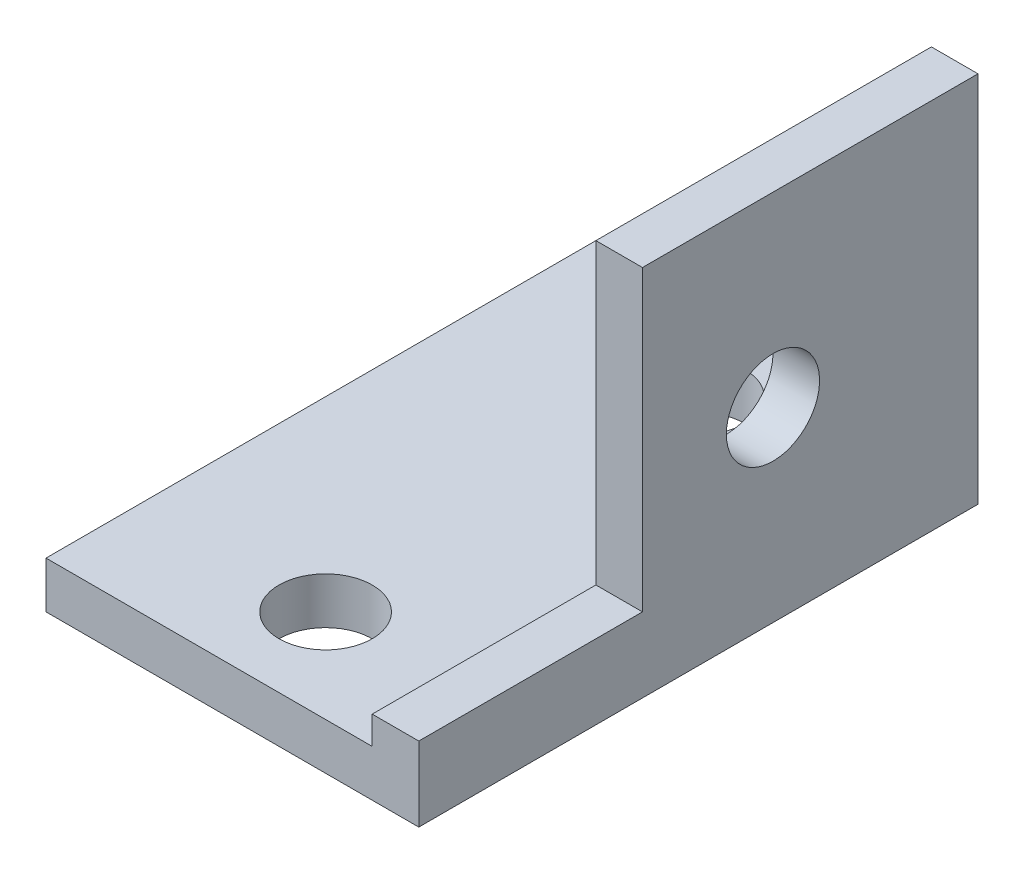
ISO-10303-21;
HEADER;
FILE_DESCRIPTION(('STEP AP214'),'2;1');
FILE_NAME('part.step','',(''),(''),'','','');
FILE_SCHEMA(('AUTOMOTIVE_DESIGN { 1 0 10303 214 1 1 1 1 }'));
ENDSEC;
DATA;
#1=APPLICATION_CONTEXT('core data for automotive mechanical design processes');
#2=APPLICATION_PROTOCOL_DEFINITION('international standard','automotive_design',2000,#1);
#3=PRODUCT_CONTEXT('',#1,'mechanical');
#4=PRODUCT('Part','Part','',(#3));
#5=PRODUCT_RELATED_PRODUCT_CATEGORY('part','',(#4));
#6=PRODUCT_DEFINITION_FORMATION('','',#4);
#7=PRODUCT_DEFINITION_CONTEXT('part definition',#1,'design');
#8=PRODUCT_DEFINITION('design','',#6,#7);
#9=PRODUCT_DEFINITION_SHAPE('','',#8);
#10=(LENGTH_UNIT() NAMED_UNIT(*) SI_UNIT(.MILLI.,.METRE.));
#11=(NAMED_UNIT(*) PLANE_ANGLE_UNIT() SI_UNIT($,.RADIAN.));
#12=(NAMED_UNIT(*) SI_UNIT($,.STERADIAN.) SOLID_ANGLE_UNIT());
#13=UNCERTAINTY_MEASURE_WITH_UNIT(LENGTH_MEASURE(1.E-05),#10,'distance_accuracy_value','');
#14=(GEOMETRIC_REPRESENTATION_CONTEXT(3) GLOBAL_UNCERTAINTY_ASSIGNED_CONTEXT((#13)) GLOBAL_UNIT_ASSIGNED_CONTEXT((#10,
#11,#12)) REPRESENTATION_CONTEXT('',''));
#15=CARTESIAN_POINT('',(0.,0.,0.));
#16=DIRECTION('',(0.,0.,1.));
#17=DIRECTION('',(1.,0.,0.));
#18=AXIS2_PLACEMENT_3D('',#15,#16,#17);
#19=CARTESIAN_POINT('',(0.,3.175,0.));
#20=DIRECTION('',(0.,1.,0.));
#21=DIRECTION('',(0.,0.,1.));
#22=AXIS2_PLACEMENT_3D('',#19,#20,#21);
#23=PLANE('',#22);
#24=CARTESIAN_POINT('',(1.5875,3.175,-12.7));
#25=DIRECTION('',(0.,1.,0.));
#26=DIRECTION('',(0.,0.,1.));
#27=AXIS2_PLACEMENT_3D('',#24,#25,#26);
#28=CIRCLE('',#27,3.175);
#29=CARTESIAN_POINT('',(1.5875,3.175,-9.52500000000001));
#30=VERTEX_POINT('',#29);
#31=EDGE_CURVE('E162',#30,#30,#28,.T.);
#32=ORIENTED_EDGE('',*,*,#31,.F.);
#33=EDGE_LOOP('',(#32));
#34=FACE_BOUND('',#33,.T.);
#35=DIRECTION('',(0.,0.,-1.));
#36=VECTOR('',#35,1.);
#37=CARTESIAN_POINT('',(11.1125,3.175,-19.05));
#38=LINE('',#37,#36);
#39=CARTESIAN_POINT('',(11.1125,3.175,19.05));
#40=VERTEX_POINT('',#39);
#41=CARTESIAN_POINT('',(11.1125,3.175,-19.05));
#42=VERTEX_POINT('',#41);
#43=EDGE_CURVE('E168',#40,#42,#38,.T.);
#44=ORIENTED_EDGE('',*,*,#43,.T.);
#45=DIRECTION('',(-1.,0.,0.));
#46=VECTOR('',#45,1.);
#47=CARTESIAN_POINT('',(-11.1125,3.175,-19.05));
#48=LINE('',#47,#46);
#49=CARTESIAN_POINT('',(-11.1125,3.175,-19.05));
#50=VERTEX_POINT('',#49);
#51=EDGE_CURVE('E171',#42,#50,#48,.T.);
#52=ORIENTED_EDGE('',*,*,#51,.T.);
#53=DIRECTION('',(0.,0.,1.));
#54=VECTOR('',#53,1.);
#55=CARTESIAN_POINT('',(-11.1125,3.175,-19.05));
#56=LINE('',#55,#54);
#57=CARTESIAN_POINT('',(-11.1125,3.175,19.05));
#58=VERTEX_POINT('',#57);
#59=EDGE_CURVE('E56',#50,#58,#56,.T.);
#60=ORIENTED_EDGE('',*,*,#59,.T.);
#61=DIRECTION('',(1.,0.,0.));
#62=VECTOR('',#61,1.);
#63=CARTESIAN_POINT('',(-11.1125,3.175,19.05));
#64=LINE('',#63,#62);
#65=EDGE_CURVE('E175',#58,#40,#64,.T.);
#66=ORIENTED_EDGE('',*,*,#65,.T.);
#67=EDGE_LOOP('',(#44,#52,#60,#66));
#68=FACE_BOUND('',#67,.T.);
#69=CARTESIAN_POINT('',(1.5875,3.175,12.7));
#70=DIRECTION('',(0.,1.,0.));
#71=DIRECTION('',(0.,0.,1.));
#72=AXIS2_PLACEMENT_3D('',#69,#70,#71);
#73=CIRCLE('',#72,3.175);
#74=CARTESIAN_POINT('',(1.5875,3.175,15.875));
#75=VERTEX_POINT('',#74);
#76=EDGE_CURVE('E156',#75,#75,#73,.T.);
#77=ORIENTED_EDGE('',*,*,#76,.F.);
#78=EDGE_LOOP('',(#77));
#79=FACE_BOUND('',#78,.T.);
#80=ADVANCED_FACE('F32',(#34,#68,#79),#23,.T.);
#81=CARTESIAN_POINT('',(0.,0.,0.));
#82=DIRECTION('',(0.,1.,0.));
#83=DIRECTION('',(0.,0.,1.));
#84=AXIS2_PLACEMENT_3D('',#81,#82,#83);
#85=PLANE('',#84);
#86=DIRECTION('',(-1.,0.,0.));
#87=VECTOR('',#86,1.);
#88=CARTESIAN_POINT('',(-11.1125,0.,-19.05));
#89=LINE('',#88,#87);
#90=CARTESIAN_POINT('',(14.2875,0.,-19.05));
#91=VERTEX_POINT('',#90);
#92=CARTESIAN_POINT('',(-11.1125,0.,-19.05));
#93=VERTEX_POINT('',#92);
#94=EDGE_CURVE('E165',#91,#93,#89,.T.);
#95=ORIENTED_EDGE('',*,*,#94,.F.);
#96=DIRECTION('',(0.,0.,-1.));
#97=VECTOR('',#96,1.);
#98=CARTESIAN_POINT('',(14.2875,0.,-19.05));
#99=LINE('',#98,#97);
#100=CARTESIAN_POINT('',(14.2875,0.,19.05));
#101=VERTEX_POINT('',#100);
#102=EDGE_CURVE('E136',#101,#91,#99,.T.);
#103=ORIENTED_EDGE('',*,*,#102,.F.);
#104=DIRECTION('',(1.,0.,0.));
#105=VECTOR('',#104,1.);
#106=CARTESIAN_POINT('',(-11.1125,0.,19.05));
#107=LINE('',#106,#105);
#108=CARTESIAN_POINT('',(-11.1125,0.,19.05));
#109=VERTEX_POINT('',#108);
#110=EDGE_CURVE('E172',#109,#101,#107,.T.);
#111=ORIENTED_EDGE('',*,*,#110,.F.);
#112=DIRECTION('',(0.,0.,1.));
#113=VECTOR('',#112,1.);
#114=CARTESIAN_POINT('',(-11.1125,0.,-19.05));
#115=LINE('',#114,#113);
#116=EDGE_CURVE('E69',#93,#109,#115,.T.);
#117=ORIENTED_EDGE('',*,*,#116,.F.);
#118=EDGE_LOOP('',(#95,#103,#111,#117));
#119=FACE_BOUND('',#118,.T.);
#120=CARTESIAN_POINT('',(1.5875,0.,-12.7));
#121=DIRECTION('',(0.,1.,0.));
#122=DIRECTION('',(0.,0.,1.));
#123=AXIS2_PLACEMENT_3D('',#120,#121,#122);
#124=CIRCLE('',#123,3.175);
#125=CARTESIAN_POINT('',(1.5875,0.,-9.52500000000001));
#126=VERTEX_POINT('',#125);
#127=EDGE_CURVE('E159',#126,#126,#124,.T.);
#128=ORIENTED_EDGE('',*,*,#127,.T.);
#129=EDGE_LOOP('',(#128));
#130=FACE_BOUND('',#129,.T.);
#131=CARTESIAN_POINT('',(1.5875,0.,12.7));
#132=DIRECTION('',(0.,1.,0.));
#133=DIRECTION('',(0.,0.,1.));
#134=AXIS2_PLACEMENT_3D('',#131,#132,#133);
#135=CIRCLE('',#134,3.175);
#136=CARTESIAN_POINT('',(1.5875,0.,15.875));
#137=VERTEX_POINT('',#136);
#138=EDGE_CURVE('E155',#137,#137,#135,.T.);
#139=ORIENTED_EDGE('',*,*,#138,.T.);
#140=EDGE_LOOP('',(#139));
#141=FACE_BOUND('',#140,.T.);
#142=ADVANCED_FACE('F186',(#119,#130,#141),#85,.F.);
#143=CARTESIAN_POINT('',(-11.1125,3.175,-19.05));
#144=DIRECTION('',(0.,0.,1.));
#145=DIRECTION('',(1.,0.,0.));
#146=AXIS2_PLACEMENT_3D('',#143,#144,#145);
#147=PLANE('',#146);
#148=ORIENTED_EDGE('',*,*,#94,.T.);
#149=DIRECTION('',(0.,-1.,0.));
#150=VECTOR('',#149,1.);
#151=CARTESIAN_POINT('',(-11.1125,3.175,-19.05));
#152=LINE('',#151,#150);
#153=EDGE_CURVE('E11',#50,#93,#152,.T.);
#154=ORIENTED_EDGE('',*,*,#153,.F.);
#155=ORIENTED_EDGE('',*,*,#51,.F.);
#156=DIRECTION('',(0.,-1.,0.));
#157=VECTOR('',#156,1.);
#158=CARTESIAN_POINT('',(11.1125,25.4,-19.05));
#159=LINE('',#158,#157);
#160=CARTESIAN_POINT('',(11.1125,25.4,-19.05));
#161=VERTEX_POINT('',#160);
#162=EDGE_CURVE('E76',#161,#42,#159,.T.);
#163=ORIENTED_EDGE('',*,*,#162,.F.);
#164=DIRECTION('',(-1.,0.,0.));
#165=VECTOR('',#164,1.);
#166=CARTESIAN_POINT('',(11.1125,25.4,-19.05));
#167=LINE('',#166,#165);
#168=CARTESIAN_POINT('',(14.2875,25.4,-19.05));
#169=VERTEX_POINT('',#168);
#170=EDGE_CURVE('E143',#169,#161,#167,.T.);
#171=ORIENTED_EDGE('',*,*,#170,.F.);
#172=DIRECTION('',(0.,-1.,0.));
#173=VECTOR('',#172,1.);
#174=CARTESIAN_POINT('',(14.2875,25.4,-19.05));
#175=LINE('',#174,#173);
#176=EDGE_CURVE('E148',#169,#91,#175,.T.);
#177=ORIENTED_EDGE('',*,*,#176,.T.);
#178=EDGE_LOOP('',(#148,#154,#155,#163,#171,#177));
#179=FACE_BOUND('',#178,.T.);
#180=ADVANCED_FACE('F34',(#179),#147,.F.);
#181=CARTESIAN_POINT('',(-11.1125,3.175,-19.05));
#182=DIRECTION('',(1.,0.,0.));
#183=DIRECTION('',(0.,0.,-1.));
#184=AXIS2_PLACEMENT_3D('',#181,#182,#183);
#185=PLANE('',#184);
#186=ORIENTED_EDGE('',*,*,#116,.T.);
#187=DIRECTION('',(0.,-1.,0.));
#188=VECTOR('',#187,1.);
#189=CARTESIAN_POINT('',(-11.1125,3.175,19.05));
#190=LINE('',#189,#188);
#191=EDGE_CURVE('E40',#58,#109,#190,.T.);
#192=ORIENTED_EDGE('',*,*,#191,.F.);
#193=ORIENTED_EDGE('',*,*,#59,.F.);
#194=ORIENTED_EDGE('',*,*,#153,.T.);
#195=EDGE_LOOP('',(#186,#192,#193,#194));
#196=FACE_BOUND('',#195,.T.);
#197=ADVANCED_FACE('F213',(#196),#185,.F.);
#198=CARTESIAN_POINT('',(-11.1125,3.175,19.05));
#199=DIRECTION('',(0.,0.,-1.));
#200=DIRECTION('',(-1.,0.,0.));
#201=AXIS2_PLACEMENT_3D('',#198,#199,#200);
#202=PLANE('',#201);
#203=DIRECTION('',(0.,-1.,0.));
#204=VECTOR('',#203,1.);
#205=CARTESIAN_POINT('',(14.2875,25.4,19.05));
#206=LINE('',#205,#204);
#207=CARTESIAN_POINT('',(14.2875,5.07999999999999,19.05));
#208=VERTEX_POINT('',#207);
#209=EDGE_CURVE('E151',#208,#101,#206,.T.);
#210=ORIENTED_EDGE('',*,*,#209,.F.);
#211=DIRECTION('',(-1.,0.,0.));
#212=VECTOR('',#211,1.);
#213=CARTESIAN_POINT('',(14.2875,5.07999999999999,19.05));
#214=LINE('',#213,#212);
#215=CARTESIAN_POINT('',(11.1125,5.07999999999999,19.05));
#216=VERTEX_POINT('',#215);
#217=EDGE_CURVE('E113',#208,#216,#214,.T.);
#218=ORIENTED_EDGE('',*,*,#217,.T.);
#219=DIRECTION('',(0.,-1.,0.));
#220=VECTOR('',#219,1.);
#221=CARTESIAN_POINT('',(11.1125,25.4,19.05));
#222=LINE('',#221,#220);
#223=EDGE_CURVE('E153',#216,#40,#222,.T.);
#224=ORIENTED_EDGE('',*,*,#223,.T.);
#225=ORIENTED_EDGE('',*,*,#65,.F.);
#226=ORIENTED_EDGE('',*,*,#191,.T.);
#227=ORIENTED_EDGE('',*,*,#110,.T.);
#228=EDGE_LOOP('',(#210,#218,#224,#225,#226,#227));
#229=FACE_BOUND('',#228,.T.);
#230=ADVANCED_FACE('F183',(#229),#202,.F.);
#231=CARTESIAN_POINT('',(1.5875,3.175,-12.7));
#232=DIRECTION('',(0.,-1.,0.));
#233=DIRECTION('',(0.,0.,-1.));
#234=AXIS2_PLACEMENT_3D('',#231,#232,#233);
#235=CYLINDRICAL_SURFACE('',#234,3.175);
#236=ORIENTED_EDGE('',*,*,#31,.T.);
#237=EDGE_LOOP('',(#236));
#238=FACE_BOUND('',#237,.T.);
#239=ORIENTED_EDGE('',*,*,#127,.F.);
#240=EDGE_LOOP('',(#239));
#241=FACE_BOUND('',#240,.T.);
#242=ADVANCED_FACE('F204',(#238,#241),#235,.F.);
#243=CARTESIAN_POINT('',(1.5875,3.175,12.7));
#244=DIRECTION('',(0.,-1.,0.));
#245=DIRECTION('',(0.,0.,-1.));
#246=AXIS2_PLACEMENT_3D('',#243,#244,#245);
#247=CYLINDRICAL_SURFACE('',#246,3.175);
#248=ORIENTED_EDGE('',*,*,#76,.T.);
#249=EDGE_LOOP('',(#248));
#250=FACE_BOUND('',#249,.T.);
#251=ORIENTED_EDGE('',*,*,#138,.F.);
#252=EDGE_LOOP('',(#251));
#253=FACE_BOUND('',#252,.T.);
#254=ADVANCED_FACE('F201',(#250,#253),#247,.F.);
#255=CARTESIAN_POINT('',(11.1125,25.4,-19.05));
#256=DIRECTION('',(1.,0.,0.));
#257=DIRECTION('',(0.,0.,-1.));
#258=AXIS2_PLACEMENT_3D('',#255,#256,#257);
#259=PLANE('',#258);
#260=CARTESIAN_POINT('',(11.1125,12.7,-5.08));
#261=DIRECTION('',(-1.,0.,0.));
#262=DIRECTION('',(0.,0.,1.));
#263=AXIS2_PLACEMENT_3D('',#260,#261,#262);
#264=CIRCLE('',#263,3.175);
#265=CARTESIAN_POINT('',(11.1125,12.7,-1.905));
#266=VERTEX_POINT('',#265);
#267=EDGE_CURVE('E131',#266,#266,#264,.T.);
#268=ORIENTED_EDGE('',*,*,#267,.F.);
#269=EDGE_LOOP('',(#268));
#270=FACE_BOUND('',#269,.T.);
#271=ORIENTED_EDGE('',*,*,#223,.F.);
#272=DIRECTION('',(0.,0.,1.));
#273=VECTOR('',#272,1.);
#274=CARTESIAN_POINT('',(11.1125,5.07999999999999,19.05));
#275=LINE('',#274,#273);
#276=CARTESIAN_POINT('',(11.1125,5.07999999999999,3.81));
#277=VERTEX_POINT('',#276);
#278=EDGE_CURVE('E127',#277,#216,#275,.T.);
#279=ORIENTED_EDGE('',*,*,#278,.F.);
#280=DIRECTION('',(0.,-1.,0.));
#281=VECTOR('',#280,1.);
#282=CARTESIAN_POINT('',(11.1125,25.4,3.81));
#283=LINE('',#282,#281);
#284=CARTESIAN_POINT('',(11.1125,25.4,3.81));
#285=VERTEX_POINT('',#284);
#286=EDGE_CURVE('E110',#285,#277,#283,.T.);
#287=ORIENTED_EDGE('',*,*,#286,.F.);
#288=DIRECTION('',(0.,0.,1.));
#289=VECTOR('',#288,1.);
#290=CARTESIAN_POINT('',(11.1125,25.4,-19.05));
#291=LINE('',#290,#289);
#292=EDGE_CURVE('E139',#161,#285,#291,.T.);
#293=ORIENTED_EDGE('',*,*,#292,.F.);
#294=ORIENTED_EDGE('',*,*,#162,.T.);
#295=ORIENTED_EDGE('',*,*,#43,.F.);
#296=EDGE_LOOP('',(#271,#279,#287,#293,#294,#295));
#297=FACE_BOUND('',#296,.T.);
#298=ADVANCED_FACE('F194',(#270,#297),#259,.F.);
#299=CARTESIAN_POINT('',(14.2875,25.4,-19.05));
#300=DIRECTION('',(-1.,0.,0.));
#301=DIRECTION('',(0.,0.,1.));
#302=AXIS2_PLACEMENT_3D('',#299,#300,#301);
#303=PLANE('',#302);
#304=CARTESIAN_POINT('',(14.2875,12.7,-5.08));
#305=DIRECTION('',(-1.,0.,0.));
#306=DIRECTION('',(0.,0.,1.));
#307=AXIS2_PLACEMENT_3D('',#304,#305,#306);
#308=CIRCLE('',#307,3.175);
#309=CARTESIAN_POINT('',(14.2875,12.7,-1.905));
#310=VERTEX_POINT('',#309);
#311=EDGE_CURVE('E134',#310,#310,#308,.T.);
#312=ORIENTED_EDGE('',*,*,#311,.T.);
#313=EDGE_LOOP('',(#312));
#314=FACE_BOUND('',#313,.T.);
#315=DIRECTION('',(0.,-1.,0.));
#316=VECTOR('',#315,1.);
#317=CARTESIAN_POINT('',(14.2875,25.4,3.81));
#318=LINE('',#317,#316);
#319=CARTESIAN_POINT('',(14.2875,25.4,3.80999999999999));
#320=VERTEX_POINT('',#319);
#321=CARTESIAN_POINT('',(14.2875,5.07999999999999,3.81));
#322=VERTEX_POINT('',#321);
#323=EDGE_CURVE('E47',#320,#322,#318,.T.);
#324=ORIENTED_EDGE('',*,*,#323,.T.);
#325=DIRECTION('',(0.,0.,1.));
#326=VECTOR('',#325,1.);
#327=CARTESIAN_POINT('',(14.2875,5.07999999999999,19.05));
#328=LINE('',#327,#326);
#329=EDGE_CURVE('E117',#322,#208,#328,.T.);
#330=ORIENTED_EDGE('',*,*,#329,.T.);
#331=ORIENTED_EDGE('',*,*,#209,.T.);
#332=ORIENTED_EDGE('',*,*,#102,.T.);
#333=ORIENTED_EDGE('',*,*,#176,.F.);
#334=DIRECTION('',(0.,0.,-1.));
#335=VECTOR('',#334,1.);
#336=CARTESIAN_POINT('',(14.2875,25.4,-19.05));
#337=LINE('',#336,#335);
#338=EDGE_CURVE('E126',#320,#169,#337,.T.);
#339=ORIENTED_EDGE('',*,*,#338,.F.);
#340=EDGE_LOOP('',(#324,#330,#331,#332,#333,#339));
#341=FACE_BOUND('',#340,.T.);
#342=ADVANCED_FACE('F124',(#314,#341),#303,.F.);
#343=CARTESIAN_POINT('',(0.,25.4,0.));
#344=DIRECTION('',(0.,1.,0.));
#345=DIRECTION('',(0.,0.,1.));
#346=AXIS2_PLACEMENT_3D('',#343,#344,#345);
#347=PLANE('',#346);
#348=DIRECTION('',(-1.,0.,0.));
#349=VECTOR('',#348,1.);
#350=CARTESIAN_POINT('',(14.2875,25.4,3.81));
#351=LINE('',#350,#349);
#352=EDGE_CURVE('E114',#320,#285,#351,.T.);
#353=ORIENTED_EDGE('',*,*,#352,.F.);
#354=ORIENTED_EDGE('',*,*,#338,.T.);
#355=ORIENTED_EDGE('',*,*,#170,.T.);
#356=ORIENTED_EDGE('',*,*,#292,.T.);
#357=EDGE_LOOP('',(#353,#354,#355,#356));
#358=FACE_BOUND('',#357,.T.);
#359=ADVANCED_FACE('F192',(#358),#347,.T.);
#360=CARTESIAN_POINT('',(14.2875,5.07999999999999,19.05));
#361=DIRECTION('',(0.,-1.,0.));
#362=DIRECTION('',(0.,0.,-1.));
#363=AXIS2_PLACEMENT_3D('',#360,#361,#362);
#364=PLANE('',#363);
#365=ORIENTED_EDGE('',*,*,#278,.T.);
#366=ORIENTED_EDGE('',*,*,#217,.F.);
#367=ORIENTED_EDGE('',*,*,#329,.F.);
#368=DIRECTION('',(-1.,0.,0.));
#369=VECTOR('',#368,1.);
#370=CARTESIAN_POINT('',(14.2875,5.07999999999999,3.81));
#371=LINE('',#370,#369);
#372=EDGE_CURVE('E106',#322,#277,#371,.T.);
#373=ORIENTED_EDGE('',*,*,#372,.T.);
#374=EDGE_LOOP('',(#365,#366,#367,#373));
#375=FACE_BOUND('',#374,.T.);
#376=ADVANCED_FACE('F118',(#375),#364,.F.);
#377=CARTESIAN_POINT('',(14.2875,25.4,3.81));
#378=DIRECTION('',(0.,0.,-1.));
#379=DIRECTION('',(0.,1.,0.));
#380=AXIS2_PLACEMENT_3D('',#377,#378,#379);
#381=PLANE('',#380);
#382=ORIENTED_EDGE('',*,*,#286,.T.);
#383=ORIENTED_EDGE('',*,*,#372,.F.);
#384=ORIENTED_EDGE('',*,*,#323,.F.);
#385=ORIENTED_EDGE('',*,*,#352,.T.);
#386=EDGE_LOOP('',(#382,#383,#384,#385));
#387=FACE_BOUND('',#386,.T.);
#388=ADVANCED_FACE('F108',(#387),#381,.F.);
#389=CARTESIAN_POINT('',(14.2875,12.7,-5.08));
#390=DIRECTION('',(-1.,0.,0.));
#391=DIRECTION('',(0.,0.,1.));
#392=AXIS2_PLACEMENT_3D('',#389,#390,#391);
#393=CYLINDRICAL_SURFACE('',#392,3.175);
#394=CARTESIAN_POINT('',(14.2875,12.7,-1.905));
#395=CARTESIAN_POINT('',(14.2544270833333,12.7,-1.905));
#396=CARTESIAN_POINT('',(14.2213541666667,12.7,-1.905));
#397=CARTESIAN_POINT('',(14.1552083333333,12.7,-1.905));
#398=CARTESIAN_POINT('',(14.1221354166667,12.7,-1.905));
#399=CARTESIAN_POINT('',(14.0559895833333,12.7,-1.905));
#400=CARTESIAN_POINT('',(14.0229166666667,12.7,-1.905));
#401=CARTESIAN_POINT('',(13.9567708333333,12.7,-1.905));
#402=CARTESIAN_POINT('',(13.9236979166667,12.7,-1.905));
#403=CARTESIAN_POINT('',(13.8575520833333,12.7,-1.905));
#404=CARTESIAN_POINT('',(13.8244791666667,12.7,-1.905));
#405=CARTESIAN_POINT('',(13.7583333333333,12.7,-1.905));
#406=CARTESIAN_POINT('',(13.7252604166667,12.7,-1.905));
#407=CARTESIAN_POINT('',(13.6591145833333,12.7,-1.905));
#408=CARTESIAN_POINT('',(13.6260416666667,12.7,-1.905));
#409=CARTESIAN_POINT('',(13.5598958333333,12.7,-1.905));
#410=CARTESIAN_POINT('',(13.5268229166667,12.7,-1.905));
#411=CARTESIAN_POINT('',(13.4606770833333,12.7,-1.905));
#412=CARTESIAN_POINT('',(13.4276041666667,12.7,-1.905));
#413=CARTESIAN_POINT('',(13.3614583333333,12.7,-1.905));
#414=CARTESIAN_POINT('',(13.3283854166667,12.7,-1.905));
#415=CARTESIAN_POINT('',(13.2622395833333,12.7,-1.905));
#416=CARTESIAN_POINT('',(13.2291666666667,12.7,-1.905));
#417=CARTESIAN_POINT('',(13.1630208333333,12.7,-1.905));
#418=CARTESIAN_POINT('',(13.1299479166667,12.7,-1.905));
#419=CARTESIAN_POINT('',(13.0638020833333,12.7,-1.905));
#420=CARTESIAN_POINT('',(13.0307291666667,12.7,-1.905));
#421=CARTESIAN_POINT('',(12.9645833333333,12.7,-1.905));
#422=CARTESIAN_POINT('',(12.9315104166667,12.7,-1.905));
#423=CARTESIAN_POINT('',(12.8653645833333,12.7,-1.905));
#424=CARTESIAN_POINT('',(12.8322916666667,12.7,-1.905));
#425=CARTESIAN_POINT('',(12.7661458333333,12.7,-1.905));
#426=CARTESIAN_POINT('',(12.7330729166667,12.7,-1.905));
#427=CARTESIAN_POINT('',(12.6669270833333,12.7,-1.905));
#428=CARTESIAN_POINT('',(12.6338541666667,12.7,-1.905));
#429=CARTESIAN_POINT('',(12.5677083333333,12.7,-1.905));
#430=CARTESIAN_POINT('',(12.5346354166667,12.7,-1.905));
#431=CARTESIAN_POINT('',(12.4684895833333,12.7,-1.905));
#432=CARTESIAN_POINT('',(12.4354166666667,12.7,-1.905));
#433=CARTESIAN_POINT('',(12.3692708333333,12.7,-1.905));
#434=CARTESIAN_POINT('',(12.3361979166667,12.7,-1.905));
#435=CARTESIAN_POINT('',(12.2700520833333,12.7,-1.905));
#436=CARTESIAN_POINT('',(12.2369791666667,12.7,-1.905));
#437=CARTESIAN_POINT('',(12.1708333333333,12.7,-1.905));
#438=CARTESIAN_POINT('',(12.1377604166667,12.7,-1.905));
#439=CARTESIAN_POINT('',(12.0716145833333,12.7,-1.905));
#440=CARTESIAN_POINT('',(12.0385416666667,12.7,-1.905));
#441=CARTESIAN_POINT('',(11.9723958333333,12.7,-1.905));
#442=CARTESIAN_POINT('',(11.9393229166667,12.7,-1.905));
#443=CARTESIAN_POINT('',(11.8731770833333,12.7,-1.905));
#444=CARTESIAN_POINT('',(11.8401041666667,12.7,-1.905));
#445=CARTESIAN_POINT('',(11.7739583333333,12.7,-1.905));
#446=CARTESIAN_POINT('',(11.7408854166667,12.7,-1.905));
#447=CARTESIAN_POINT('',(11.6747395833333,12.7,-1.905));
#448=CARTESIAN_POINT('',(11.6416666666667,12.7,-1.905));
#449=CARTESIAN_POINT('',(11.5755208333333,12.7,-1.905));
#450=CARTESIAN_POINT('',(11.5424479166667,12.7,-1.905));
#451=CARTESIAN_POINT('',(11.4763020833333,12.7,-1.905));
#452=CARTESIAN_POINT('',(11.4432291666667,12.7,-1.905));
#453=CARTESIAN_POINT('',(11.3770833333333,12.7,-1.905));
#454=CARTESIAN_POINT('',(11.3440104166667,12.7,-1.905));
#455=CARTESIAN_POINT('',(11.2778645833333,12.7,-1.905));
#456=CARTESIAN_POINT('',(11.2447916666667,12.7,-1.905));
#457=CARTESIAN_POINT('',(11.1786458333333,12.7,-1.905));
#458=CARTESIAN_POINT('',(11.1455729166667,12.7,-1.905));
#459=CARTESIAN_POINT('',(11.1125,12.7,-1.905));
#460=B_SPLINE_CURVE_WITH_KNOTS('',3,(#394,#395,#396,#397,#398,#399,#400,#401,#402,#403,#404,
#405,#406,#407,#408,#409,#410,#411,#412,#413,#414,#415,#416,#417,#418,#419,#420,#421,#422,#423,
#424,#425,#426,#427,#428,#429,#430,#431,#432,#433,#434,#435,#436,#437,#438,#439,#440,#441,#442,
#443,#444,#445,#446,#447,#448,#449,#450,#451,#452,#453,#454,#455,#456,#457,#458,#459),
.UNSPECIFIED.,.F.,.F.,(4,2,2,2,2,2,2,2,2,2,2,2,2,2,2,2,2,2,2,2,2,2,2,2,2,2,2,2,2,2,2,2,4),(0.,
0.0992187499999995,0.198437499999999,0.29765625,0.396875,0.496093749999999,0.5953125,0.69453125,
0.793749999999999,0.892968750000001,0.9921875,1.09140625,1.190625,1.28984375,1.3890625,
1.48828125,1.5875,1.68671875,1.7859375,1.88515625,1.984375,2.08359375,2.1828125,2.28203125,
2.38125,2.48046875,2.5796875,2.67890625,2.778125,2.87734375,2.9765625,3.07578125,3.175),.UNSPECIFIED.);
#461=EDGE_CURVE('BSEAM269',#310,#266,#460,.T.);
#462=ORIENTED_EDGE('',*,*,#311,.F.);
#463=ORIENTED_EDGE('',*,*,#267,.T.);
#464=ORIENTED_EDGE('',*,*,#461,.T.);
#465=ORIENTED_EDGE('',*,*,#461,.F.);
#466=EDGE_LOOP('',(#462,#464,#463,#465));
#467=FACE_BOUND('',#466,.T.);
#468=ADVANCED_FACE('F269',(#467),#393,.F.);
#469=CLOSED_SHELL('',(#80,#142,#180,#197,#230,#242,#254,#298,#342,#359,#376,#388,#468));
#470=MANIFOLD_SOLID_BREP('B2',#469);
#471=ADVANCED_BREP_SHAPE_REPRESENTATION('',(#18,#470),#14);
#472=SHAPE_DEFINITION_REPRESENTATION(#9,#471);
ENDSEC;
END-ISO-10303-21;
